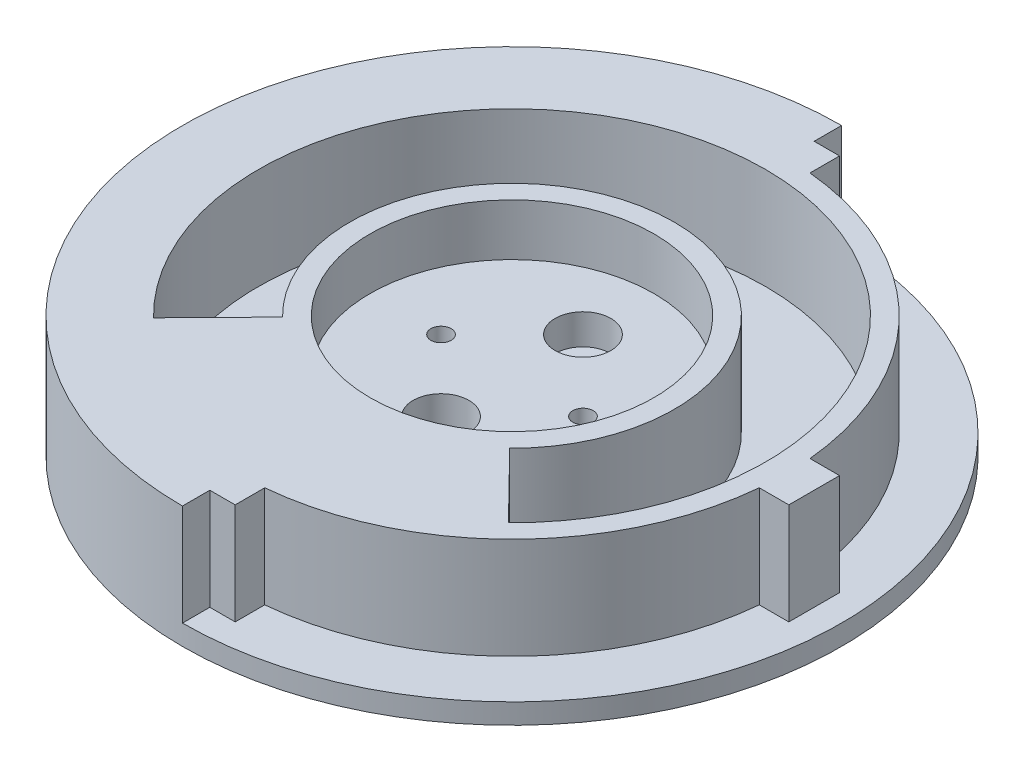
ISO-10303-21;
HEADER;
FILE_DESCRIPTION(('STEP AP214'),'2;1');
FILE_NAME('part.step','',(''),(''),'','','');
FILE_SCHEMA(('AUTOMOTIVE_DESIGN { 1 0 10303 214 1 1 1 1 }'));
ENDSEC;
DATA;
#1=APPLICATION_CONTEXT('core data for automotive mechanical design processes');
#2=APPLICATION_PROTOCOL_DEFINITION('international standard','automotive_design',2000,#1);
#3=PRODUCT_CONTEXT('',#1,'mechanical');
#4=PRODUCT('Part','Part','',(#3));
#5=PRODUCT_RELATED_PRODUCT_CATEGORY('part','',(#4));
#6=PRODUCT_DEFINITION_FORMATION('','',#4);
#7=PRODUCT_DEFINITION_CONTEXT('part definition',#1,'design');
#8=PRODUCT_DEFINITION('design','',#6,#7);
#9=PRODUCT_DEFINITION_SHAPE('','',#8);
#10=(LENGTH_UNIT() NAMED_UNIT(*) SI_UNIT(.MILLI.,.METRE.));
#11=(NAMED_UNIT(*) PLANE_ANGLE_UNIT() SI_UNIT($,.RADIAN.));
#12=(NAMED_UNIT(*) SI_UNIT($,.STERADIAN.) SOLID_ANGLE_UNIT());
#13=UNCERTAINTY_MEASURE_WITH_UNIT(LENGTH_MEASURE(1.E-05),#10,'distance_accuracy_value','');
#14=(GEOMETRIC_REPRESENTATION_CONTEXT(3) GLOBAL_UNCERTAINTY_ASSIGNED_CONTEXT((#13)) GLOBAL_UNIT_ASSIGNED_CONTEXT((#10,
#11,#12)) REPRESENTATION_CONTEXT('',''));
#15=CARTESIAN_POINT('',(0.,0.,0.));
#16=DIRECTION('',(0.,0.,1.));
#17=DIRECTION('',(1.,0.,0.));
#18=AXIS2_PLACEMENT_3D('',#15,#16,#17);
#19=CARTESIAN_POINT('',(0.,10.,7.));
#20=DIRECTION('',(0.,-1.,0.));
#21=DIRECTION('',(0.,0.,-1.));
#22=AXIS2_PLACEMENT_3D('',#19,#20,#21);
#23=CYLINDRICAL_SURFACE('',#22,1.);
#24=CARTESIAN_POINT('',(0.,-2.,7.));
#25=DIRECTION('',(0.,-1.,0.));
#26=DIRECTION('',(0.,0.,-1.));
#27=AXIS2_PLACEMENT_3D('',#24,#25,#26);
#28=CIRCLE('',#27,1.);
#29=CARTESIAN_POINT('',(0.,-2.,6.));
#30=VERTEX_POINT('',#29);
#31=EDGE_CURVE('E277',#30,#30,#28,.T.);
#32=ORIENTED_EDGE('',*,*,#31,.T.);
#33=EDGE_LOOP('',(#32));
#34=FACE_BOUND('',#33,.T.);
#35=CARTESIAN_POINT('',(0.,1.9,7.));
#36=DIRECTION('',(0.,1.,0.));
#37=DIRECTION('',(0.,0.,1.));
#38=AXIS2_PLACEMENT_3D('',#35,#36,#37);
#39=CIRCLE('',#38,1.);
#40=CARTESIAN_POINT('',(0.,1.9,8.));
#41=VERTEX_POINT('',#40);
#42=EDGE_CURVE('E43',#41,#41,#39,.F.);
#43=ORIENTED_EDGE('',*,*,#42,.F.);
#44=EDGE_LOOP('',(#43));
#45=FACE_BOUND('',#44,.T.);
#46=ADVANCED_FACE('F39',(#34,#45),#23,.F.);
#47=CARTESIAN_POINT('',(0.,10.,-7.));
#48=DIRECTION('',(0.,-1.,0.));
#49=DIRECTION('',(0.,0.,-1.));
#50=AXIS2_PLACEMENT_3D('',#47,#48,#49);
#51=CYLINDRICAL_SURFACE('',#50,1.);
#52=CARTESIAN_POINT('',(0.,-2.,-7.));
#53=DIRECTION('',(0.,-1.,0.));
#54=DIRECTION('',(0.,0.,-1.));
#55=AXIS2_PLACEMENT_3D('',#52,#53,#54);
#56=CIRCLE('',#55,1.);
#57=CARTESIAN_POINT('',(0.,-2.,-8.));
#58=VERTEX_POINT('',#57);
#59=EDGE_CURVE('E182',#58,#58,#56,.T.);
#60=ORIENTED_EDGE('',*,*,#59,.T.);
#61=EDGE_LOOP('',(#60));
#62=FACE_BOUND('',#61,.T.);
#63=CARTESIAN_POINT('',(0.,1.9,-7.));
#64=DIRECTION('',(0.,1.,0.));
#65=DIRECTION('',(0.,0.,1.));
#66=AXIS2_PLACEMENT_3D('',#63,#64,#65);
#67=CIRCLE('',#66,1.);
#68=CARTESIAN_POINT('',(0.,1.9,-6.));
#69=VERTEX_POINT('',#68);
#70=EDGE_CURVE('E278',#69,#69,#67,.F.);
#71=ORIENTED_EDGE('',*,*,#70,.F.);
#72=EDGE_LOOP('',(#71));
#73=FACE_BOUND('',#72,.T.);
#74=ADVANCED_FACE('F434',(#62,#73),#51,.F.);
#75=CARTESIAN_POINT('',(0.,0.,0.));
#76=DIRECTION('',(0.,-1.,0.));
#77=DIRECTION('',(0.,0.,-1.));
#78=AXIS2_PLACEMENT_3D('',#75,#76,#77);
#79=PLANE('',#78);
#80=DIRECTION('',(0.,0.,-1.));
#81=VECTOR('',#80,1.);
#82=CARTESIAN_POINT('',(0.,0.,-29.8));
#83=LINE('',#82,#81);
#84=CARTESIAN_POINT('',(0.,0.,-29.8));
#85=VERTEX_POINT('',#84);
#86=CARTESIAN_POINT('',(0.,0.,-32.5));
#87=VERTEX_POINT('',#86);
#88=EDGE_CURVE('E181',#85,#87,#83,.T.);
#89=ORIENTED_EDGE('',*,*,#88,.F.);
#90=DIRECTION('',(-1.,0.,0.));
#91=VECTOR('',#90,1.);
#92=CARTESIAN_POINT('',(-2.5,0.,-29.8));
#93=LINE('',#92,#91);
#94=CARTESIAN_POINT('',(2.5,0.,-29.8));
#95=VERTEX_POINT('',#94);
#96=EDGE_CURVE('E179',#95,#85,#93,.T.);
#97=ORIENTED_EDGE('',*,*,#96,.F.);
#98=DIRECTION('',(0.,0.,-1.));
#99=VECTOR('',#98,1.);
#100=CARTESIAN_POINT('',(2.5,0.,0.));
#101=LINE('',#100,#99);
#102=CARTESIAN_POINT('',(2.5,0.,-26.8840101175401));
#103=VERTEX_POINT('',#102);
#104=EDGE_CURVE('E49',#103,#95,#101,.T.);
#105=ORIENTED_EDGE('',*,*,#104,.F.);
#106=CARTESIAN_POINT('',(0.,0.,0.));
#107=DIRECTION('',(0.,1.,0.));
#108=DIRECTION('',(0.,0.,1.));
#109=AXIS2_PLACEMENT_3D('',#106,#107,#108);
#110=CIRCLE('',#109,27.);
#111=CARTESIAN_POINT('',(26.8840101175398,0.,-2.50000000000318));
#112=VERTEX_POINT('',#111);
#113=EDGE_CURVE('E209',#112,#103,#110,.T.);
#114=ORIENTED_EDGE('',*,*,#113,.F.);
#115=DIRECTION('',(-1.,0.,0.));
#116=VECTOR('',#115,1.);
#117=CARTESIAN_POINT('',(29.8000000000026,0.,-2.50000000000318));
#118=LINE('',#117,#116);
#119=CARTESIAN_POINT('',(29.8000000000026,0.,-2.50000000000318));
#120=VERTEX_POINT('',#119);
#121=EDGE_CURVE('E363',#120,#112,#118,.T.);
#122=ORIENTED_EDGE('',*,*,#121,.F.);
#123=DIRECTION('',(0.,0.,-1.));
#124=VECTOR('',#123,1.);
#125=CARTESIAN_POINT('',(29.8000000000026,0.,-2.50000000000318));
#126=LINE('',#125,#124);
#127=CARTESIAN_POINT('',(29.8000000000026,0.,2.49999999999682));
#128=VERTEX_POINT('',#127);
#129=EDGE_CURVE('E374',#128,#120,#126,.T.);
#130=ORIENTED_EDGE('',*,*,#129,.F.);
#131=DIRECTION('',(1.,0.,0.));
#132=VECTOR('',#131,1.);
#133=CARTESIAN_POINT('',(29.8000000000026,0.,2.49999999999682));
#134=LINE('',#133,#132);
#135=CARTESIAN_POINT('',(26.8840101175404,0.,2.49999999999682));
#136=VERTEX_POINT('',#135);
#137=EDGE_CURVE('E358',#136,#128,#134,.T.);
#138=ORIENTED_EDGE('',*,*,#137,.F.);
#139=CARTESIAN_POINT('',(2.50000000000583,0.,26.8840101175396));
#140=VERTEX_POINT('',#139);
#141=EDGE_CURVE('E233',#140,#136,#110,.T.);
#142=ORIENTED_EDGE('',*,*,#141,.F.);
#143=DIRECTION('',(0.,0.,-1.));
#144=VECTOR('',#143,1.);
#145=CARTESIAN_POINT('',(2.50000000000583,0.,29.7999999999995));
#146=LINE('',#145,#144);
#147=CARTESIAN_POINT('',(2.50000000000583,0.,29.7999999999995));
#148=VERTEX_POINT('',#147);
#149=EDGE_CURVE('E342',#148,#140,#146,.T.);
#150=ORIENTED_EDGE('',*,*,#149,.F.);
#151=DIRECTION('',(1.,0.,0.));
#152=VECTOR('',#151,1.);
#153=CARTESIAN_POINT('',(2.50000000000583,0.,29.7999999999995));
#154=LINE('',#153,#152);
#155=CARTESIAN_POINT('',(0.,0.,29.7999999999995));
#156=VERTEX_POINT('',#155);
#157=EDGE_CURVE('E57',#156,#148,#154,.T.);
#158=ORIENTED_EDGE('',*,*,#157,.F.);
#159=DIRECTION('',(0.,0.,-1.));
#160=VECTOR('',#159,1.);
#161=CARTESIAN_POINT('',(0.,0.,29.7999999999995));
#162=LINE('',#161,#160);
#163=CARTESIAN_POINT('',(0.,0.,32.5));
#164=VERTEX_POINT('',#163);
#165=EDGE_CURVE('E320',#164,#156,#162,.T.);
#166=ORIENTED_EDGE('',*,*,#165,.F.);
#167=CARTESIAN_POINT('',(0.,0.,0.));
#168=DIRECTION('',(0.,-1.,0.));
#169=DIRECTION('',(0.,0.,-1.));
#170=AXIS2_PLACEMENT_3D('',#167,#168,#169);
#171=CIRCLE('',#170,32.5);
#172=EDGE_CURVE('E204',#87,#164,#171,.T.);
#173=ORIENTED_EDGE('',*,*,#172,.F.);
#174=EDGE_LOOP('',(#89,#97,#105,#114,#122,#130,#138,#142,#150,#158,#166,#173));
#175=FACE_BOUND('',#174,.T.);
#176=ADVANCED_FACE('F399',(#175),#79,.F.);
#177=CARTESIAN_POINT('',(-2.5,10.,-29.8));
#178=DIRECTION('',(0.,0.,1.));
#179=DIRECTION('',(1.,0.,0.));
#180=AXIS2_PLACEMENT_3D('',#177,#178,#179);
#181=PLANE('',#180);
#182=DIRECTION('',(0.,-1.,0.));
#183=VECTOR('',#182,1.);
#184=CARTESIAN_POINT('',(0.,82.6722092687432,-29.8));
#185=LINE('',#184,#183);
#186=CARTESIAN_POINT('',(0.,9.99999999999999,-29.8));
#187=VERTEX_POINT('',#186);
#188=EDGE_CURVE('E162',#187,#85,#185,.T.);
#189=ORIENTED_EDGE('',*,*,#188,.F.);
#190=DIRECTION('',(-1.,0.,0.));
#191=VECTOR('',#190,1.);
#192=CARTESIAN_POINT('',(-2.5,10.,-29.8));
#193=LINE('',#192,#191);
#194=CARTESIAN_POINT('',(2.5,10.,-29.8));
#195=VERTEX_POINT('',#194);
#196=EDGE_CURVE('E177',#195,#187,#193,.T.);
#197=ORIENTED_EDGE('',*,*,#196,.F.);
#198=DIRECTION('',(0.,-1.,0.));
#199=VECTOR('',#198,1.);
#200=CARTESIAN_POINT('',(2.5,10.,-29.8));
#201=LINE('',#200,#199);
#202=EDGE_CURVE('E189',#195,#95,#201,.T.);
#203=ORIENTED_EDGE('',*,*,#202,.T.);
#204=ORIENTED_EDGE('',*,*,#96,.T.);
#205=EDGE_LOOP('',(#189,#197,#203,#204));
#206=FACE_BOUND('',#205,.T.);
#207=ADVANCED_FACE('F175',(#206),#181,.F.);
#208=CARTESIAN_POINT('',(2.50000000000583,10.,29.7999999999995));
#209=DIRECTION('',(0.,0.,-1.));
#210=DIRECTION('',(-1.,0.,0.));
#211=AXIS2_PLACEMENT_3D('',#208,#209,#210);
#212=PLANE('',#211);
#213=DIRECTION('',(0.,-1.,0.));
#214=VECTOR('',#213,1.);
#215=CARTESIAN_POINT('',(0.,82.6722092687432,29.7999999999995));
#216=LINE('',#215,#214);
#217=CARTESIAN_POINT('',(0.,9.99999999999999,29.7999999999995));
#218=VERTEX_POINT('',#217);
#219=EDGE_CURVE('E170',#218,#156,#216,.T.);
#220=ORIENTED_EDGE('',*,*,#219,.T.);
#221=ORIENTED_EDGE('',*,*,#157,.T.);
#222=DIRECTION('',(0.,-1.,0.));
#223=VECTOR('',#222,1.);
#224=CARTESIAN_POINT('',(2.50000000000583,10.,29.7999999999995));
#225=LINE('',#224,#223);
#226=CARTESIAN_POINT('',(2.50000000000583,10.,29.7999999999995));
#227=VERTEX_POINT('',#226);
#228=EDGE_CURVE('E346',#227,#148,#225,.T.);
#229=ORIENTED_EDGE('',*,*,#228,.F.);
#230=DIRECTION('',(1.,0.,0.));
#231=VECTOR('',#230,1.);
#232=CARTESIAN_POINT('',(2.50000000000583,10.,29.7999999999995));
#233=LINE('',#232,#231);
#234=EDGE_CURVE('E338',#218,#227,#233,.T.);
#235=ORIENTED_EDGE('',*,*,#234,.F.);
#236=EDGE_LOOP('',(#220,#221,#229,#235));
#237=FACE_BOUND('',#236,.T.);
#238=ADVANCED_FACE('F432',(#237),#212,.F.);
#239=CARTESIAN_POINT('',(0.,10.,0.));
#240=DIRECTION('',(0.,-1.,0.));
#241=DIRECTION('',(0.,0.,-1.));
#242=AXIS2_PLACEMENT_3D('',#239,#240,#241);
#243=CYLINDRICAL_SURFACE('',#242,27.);
#244=DIRECTION('',(0.,-1.,0.));
#245=VECTOR('',#244,1.);
#246=CARTESIAN_POINT('',(2.50000000000583,10.,26.8840101175396));
#247=LINE('',#246,#245);
#248=CARTESIAN_POINT('',(2.50000000000583,10.,26.8840101175396));
#249=VERTEX_POINT('',#248);
#250=EDGE_CURVE('E355',#140,#249,#247,.F.);
#251=ORIENTED_EDGE('',*,*,#250,.F.);
#252=ORIENTED_EDGE('',*,*,#141,.T.);
#253=DIRECTION('',(0.,-1.,0.));
#254=VECTOR('',#253,1.);
#255=CARTESIAN_POINT('',(26.8840101175404,10.,2.49999999999682));
#256=LINE('',#255,#254);
#257=CARTESIAN_POINT('',(26.8840101175404,10.,2.49999999999682));
#258=VERTEX_POINT('',#257);
#259=EDGE_CURVE('E199',#258,#136,#256,.T.);
#260=ORIENTED_EDGE('',*,*,#259,.F.);
#261=CARTESIAN_POINT('',(0.,10.,0.));
#262=DIRECTION('',(0.,1.,0.));
#263=DIRECTION('',(0.,0.,1.));
#264=AXIS2_PLACEMENT_3D('',#261,#262,#263);
#265=CIRCLE('',#264,27.);
#266=EDGE_CURVE('E65',#249,#258,#265,.T.);
#267=ORIENTED_EDGE('',*,*,#266,.F.);
#268=EDGE_LOOP('',(#251,#252,#260,#267));
#269=FACE_BOUND('',#268,.T.);
#270=ADVANCED_FACE('F41',(#269),#243,.T.);
#271=DIRECTION('',(0.,-1.,0.));
#272=VECTOR('',#271,1.);
#273=CARTESIAN_POINT('',(26.8840101175398,10.,-2.50000000000318));
#274=LINE('',#273,#272);
#275=CARTESIAN_POINT('',(26.8840101175398,10.,-2.50000000000318));
#276=VERTEX_POINT('',#275);
#277=EDGE_CURVE('E388',#112,#276,#274,.F.);
#278=ORIENTED_EDGE('',*,*,#277,.F.);
#279=ORIENTED_EDGE('',*,*,#113,.T.);
#280=DIRECTION('',(0.,-1.,0.));
#281=VECTOR('',#280,1.);
#282=CARTESIAN_POINT('',(2.5,10.,-26.8840101175401));
#283=LINE('',#282,#281);
#284=CARTESIAN_POINT('',(2.5,10.,-26.8840101175401));
#285=VERTEX_POINT('',#284);
#286=EDGE_CURVE('E193',#285,#103,#283,.T.);
#287=ORIENTED_EDGE('',*,*,#286,.F.);
#288=EDGE_CURVE('E260',#276,#285,#265,.T.);
#289=ORIENTED_EDGE('',*,*,#288,.F.);
#290=EDGE_LOOP('',(#278,#279,#287,#289));
#291=FACE_BOUND('',#290,.T.);
#292=ADVANCED_FACE('F423',(#291),#243,.T.);
#293=CARTESIAN_POINT('',(0.,10.,0.));
#294=DIRECTION('',(0.,1.,0.));
#295=DIRECTION('',(0.,0.,1.));
#296=AXIS2_PLACEMENT_3D('',#293,#294,#295);
#297=PLANE('',#296);
#298=ORIENTED_EDGE('',*,*,#196,.T.);
#299=DIRECTION('',(0.,0.,-1.));
#300=VECTOR('',#299,1.);
#301=CARTESIAN_POINT('',(0.,9.99999999999999,-29.8));
#302=LINE('',#301,#300);
#303=CARTESIAN_POINT('',(0.,9.99999999999999,-32.5));
#304=VERTEX_POINT('',#303);
#305=EDGE_CURVE('E158',#187,#304,#302,.T.);
#306=ORIENTED_EDGE('',*,*,#305,.T.);
#307=CARTESIAN_POINT('',(0.,9.99999999999999,0.));
#308=DIRECTION('',(0.,1.,0.));
#309=DIRECTION('',(0.,0.,1.));
#310=AXIS2_PLACEMENT_3D('',#307,#308,#309);
#311=CIRCLE('',#310,32.5);
#312=CARTESIAN_POINT('',(0.,9.99999999999999,32.5));
#313=VERTEX_POINT('',#312);
#314=EDGE_CURVE('E169',#304,#313,#311,.T.);
#315=ORIENTED_EDGE('',*,*,#314,.T.);
#316=DIRECTION('',(0.,0.,-1.));
#317=VECTOR('',#316,1.);
#318=CARTESIAN_POINT('',(0.,9.99999999999999,29.7999999999995));
#319=LINE('',#318,#317);
#320=EDGE_CURVE('E326',#313,#218,#319,.T.);
#321=ORIENTED_EDGE('',*,*,#320,.T.);
#322=ORIENTED_EDGE('',*,*,#234,.T.);
#323=DIRECTION('',(0.,0.,-1.));
#324=VECTOR('',#323,1.);
#325=CARTESIAN_POINT('',(2.50000000000583,10.,29.7999999999995));
#326=LINE('',#325,#324);
#327=EDGE_CURVE('E341',#227,#249,#326,.T.);
#328=ORIENTED_EDGE('',*,*,#327,.T.);
#329=ORIENTED_EDGE('',*,*,#266,.T.);
#330=DIRECTION('',(1.,0.,0.));
#331=VECTOR('',#330,1.);
#332=CARTESIAN_POINT('',(29.8000000000026,10.,2.49999999999682));
#333=LINE('',#332,#331);
#334=CARTESIAN_POINT('',(29.8000000000026,10.,2.49999999999682));
#335=VERTEX_POINT('',#334);
#336=EDGE_CURVE('E359',#258,#335,#333,.T.);
#337=ORIENTED_EDGE('',*,*,#336,.T.);
#338=DIRECTION('',(0.,0.,-1.));
#339=VECTOR('',#338,1.);
#340=CARTESIAN_POINT('',(29.8000000000026,10.,-2.50000000000318));
#341=LINE('',#340,#339);
#342=CARTESIAN_POINT('',(29.8000000000026,10.,-2.50000000000318));
#343=VERTEX_POINT('',#342);
#344=EDGE_CURVE('E362',#335,#343,#341,.T.);
#345=ORIENTED_EDGE('',*,*,#344,.T.);
#346=DIRECTION('',(-1.,0.,0.));
#347=VECTOR('',#346,1.);
#348=CARTESIAN_POINT('',(29.8000000000026,10.,-2.50000000000318));
#349=LINE('',#348,#347);
#350=EDGE_CURVE('E366',#343,#276,#349,.T.);
#351=ORIENTED_EDGE('',*,*,#350,.T.);
#352=ORIENTED_EDGE('',*,*,#288,.T.);
#353=DIRECTION('',(0.,0.,-1.));
#354=VECTOR('',#353,1.);
#355=CARTESIAN_POINT('',(2.5,10.,-29.8));
#356=LINE('',#355,#354);
#357=EDGE_CURVE('E187',#285,#195,#356,.T.);
#358=ORIENTED_EDGE('',*,*,#357,.T.);
#359=EDGE_LOOP('',(#298,#306,#315,#321,#322,#328,#329,#337,#345,#351,#352,#358));
#360=FACE_BOUND('',#359,.T.);
#361=CARTESIAN_POINT('',(0.,10.,0.));
#362=DIRECTION('',(0.,1.,0.));
#363=DIRECTION('',(0.,0.,1.));
#364=AXIS2_PLACEMENT_3D('',#361,#362,#363);
#365=CIRCLE('',#364,14.);
#366=CARTESIAN_POINT('',(0.,10.,14.));
#367=VERTEX_POINT('',#366);
#368=EDGE_CURVE('E256',#367,#367,#365,.T.);
#369=ORIENTED_EDGE('',*,*,#368,.F.);
#370=EDGE_LOOP('',(#369));
#371=FACE_BOUND('',#370,.T.);
#372=DIRECTION('',(0.7,0.,-0.714142842854285));
#373=VECTOR('',#372,1.);
#374=CARTESIAN_POINT('',(-17.5,10.,17.8535710713571));
#375=LINE('',#374,#373);
#376=CARTESIAN_POINT('',(-17.5,10.,17.8535710713571));
#377=VERTEX_POINT('',#376);
#378=CARTESIAN_POINT('',(-11.2,10.,11.4262854856686));
#379=VERTEX_POINT('',#378);
#380=EDGE_CURVE('E216',#377,#379,#375,.T.);
#381=ORIENTED_EDGE('',*,*,#380,.F.);
#382=CARTESIAN_POINT('',(0.,10.,0.));
#383=DIRECTION('',(0.,1.,0.));
#384=DIRECTION('',(0.,0.,1.));
#385=AXIS2_PLACEMENT_3D('',#382,#383,#384);
#386=CIRCLE('',#385,25.);
#387=CARTESIAN_POINT('',(17.5,10.,17.8535710713571));
#388=VERTEX_POINT('',#387);
#389=EDGE_CURVE('E213',#388,#377,#386,.T.);
#390=ORIENTED_EDGE('',*,*,#389,.F.);
#391=DIRECTION('',(0.7,0.,0.714142842854285));
#392=VECTOR('',#391,1.);
#393=CARTESIAN_POINT('',(17.5,10.,17.8535710713571));
#394=LINE('',#393,#392);
#395=CARTESIAN_POINT('',(11.2,10.,11.4262854856686));
#396=VERTEX_POINT('',#395);
#397=EDGE_CURVE('E224',#396,#388,#394,.T.);
#398=ORIENTED_EDGE('',*,*,#397,.F.);
#399=CARTESIAN_POINT('',(0.,10.,0.));
#400=DIRECTION('',(0.,-1.,0.));
#401=DIRECTION('',(0.,0.,1.));
#402=AXIS2_PLACEMENT_3D('',#399,#400,#401);
#403=CIRCLE('',#402,16.);
#404=EDGE_CURVE('E220',#379,#396,#403,.T.);
#405=ORIENTED_EDGE('',*,*,#404,.F.);
#406=EDGE_LOOP('',(#381,#390,#398,#405));
#407=FACE_BOUND('',#406,.T.);
#408=ADVANCED_FACE('F184',(#360,#371,#407),#297,.T.);
#409=CARTESIAN_POINT('',(0.,10.,0.));
#410=DIRECTION('',(0.,-1.,0.));
#411=DIRECTION('',(0.,0.,-1.));
#412=AXIS2_PLACEMENT_3D('',#409,#410,#411);
#413=CYLINDRICAL_SURFACE('',#412,14.);
#414=CARTESIAN_POINT('',(0.,4.9,0.));
#415=DIRECTION('',(0.,1.,0.));
#416=DIRECTION('',(0.,0.,1.));
#417=AXIS2_PLACEMENT_3D('',#414,#415,#416);
#418=CIRCLE('',#417,14.);
#419=CARTESIAN_POINT('',(0.,4.9,14.));
#420=VERTEX_POINT('',#419);
#421=EDGE_CURVE('E11',#420,#420,#418,.T.);
#422=ORIENTED_EDGE('',*,*,#421,.F.);
#423=EDGE_LOOP('',(#422));
#424=FACE_BOUND('',#423,.T.);
#425=ORIENTED_EDGE('',*,*,#368,.T.);
#426=EDGE_LOOP('',(#425));
#427=FACE_BOUND('',#426,.T.);
#428=ADVANCED_FACE('F431',(#424,#427),#413,.F.);
#429=CARTESIAN_POINT('',(0.,10.,0.));
#430=DIRECTION('',(0.,-1.,0.));
#431=DIRECTION('',(0.,0.,-1.));
#432=AXIS2_PLACEMENT_3D('',#429,#430,#431);
#433=CYLINDRICAL_SURFACE('',#432,25.);
#434=CARTESIAN_POINT('',(0.,0.,0.));
#435=DIRECTION('',(0.,1.,0.));
#436=DIRECTION('',(0.,0.,1.));
#437=AXIS2_PLACEMENT_3D('',#434,#435,#436);
#438=CIRCLE('',#437,25.);
#439=CARTESIAN_POINT('',(17.5,0.,17.8535710713571));
#440=VERTEX_POINT('',#439);
#441=CARTESIAN_POINT('',(-17.5,0.,17.8535710713571));
#442=VERTEX_POINT('',#441);
#443=EDGE_CURVE('E228',#440,#442,#438,.T.);
#444=ORIENTED_EDGE('',*,*,#443,.F.);
#445=DIRECTION('',(0.,-1.,0.));
#446=VECTOR('',#445,1.);
#447=CARTESIAN_POINT('',(17.5,10.,17.8535710713571));
#448=LINE('',#447,#446);
#449=EDGE_CURVE('E227',#388,#440,#448,.T.);
#450=ORIENTED_EDGE('',*,*,#449,.F.);
#451=ORIENTED_EDGE('',*,*,#389,.T.);
#452=DIRECTION('',(0.,-1.,0.));
#453=VECTOR('',#452,1.);
#454=CARTESIAN_POINT('',(-17.5,10.,17.8535710713571));
#455=LINE('',#454,#453);
#456=EDGE_CURVE('E252',#377,#442,#455,.T.);
#457=ORIENTED_EDGE('',*,*,#456,.T.);
#458=EDGE_LOOP('',(#444,#450,#451,#457));
#459=FACE_BOUND('',#458,.T.);
#460=ADVANCED_FACE('F494',(#459),#433,.F.);
#461=CARTESIAN_POINT('',(-17.5,10.,17.8535710713571));
#462=DIRECTION('',(-0.714142842854285,0.,-0.7));
#463=DIRECTION('',(-0.7,0.,0.714142842854285));
#464=AXIS2_PLACEMENT_3D('',#461,#462,#463);
#465=PLANE('',#464);
#466=DIRECTION('',(0.7,0.,-0.714142842854285));
#467=VECTOR('',#466,1.);
#468=CARTESIAN_POINT('',(-17.5,0.,17.8535710713571));
#469=LINE('',#468,#467);
#470=CARTESIAN_POINT('',(-11.2,0.,11.4262854856686));
#471=VERTEX_POINT('',#470);
#472=EDGE_CURVE('E232',#442,#471,#469,.T.);
#473=ORIENTED_EDGE('',*,*,#472,.F.);
#474=ORIENTED_EDGE('',*,*,#456,.F.);
#475=ORIENTED_EDGE('',*,*,#380,.T.);
#476=DIRECTION('',(0.,-1.,0.));
#477=VECTOR('',#476,1.);
#478=CARTESIAN_POINT('',(-11.2,10.,11.4262854856686));
#479=LINE('',#478,#477);
#480=EDGE_CURVE('E249',#379,#471,#479,.T.);
#481=ORIENTED_EDGE('',*,*,#480,.T.);
#482=EDGE_LOOP('',(#473,#474,#475,#481));
#483=FACE_BOUND('',#482,.T.);
#484=ADVANCED_FACE('F490',(#483),#465,.T.);
#485=CARTESIAN_POINT('',(0.,10.,0.));
#486=DIRECTION('',(0.,-1.,0.));
#487=DIRECTION('',(0.,0.,-1.));
#488=AXIS2_PLACEMENT_3D('',#485,#486,#487);
#489=CYLINDRICAL_SURFACE('',#488,16.);
#490=CARTESIAN_POINT('',(0.,0.,0.));
#491=DIRECTION('',(0.,-1.,0.));
#492=DIRECTION('',(0.,0.,1.));
#493=AXIS2_PLACEMENT_3D('',#490,#491,#492);
#494=CIRCLE('',#493,16.);
#495=CARTESIAN_POINT('',(11.2,0.,11.4262854856686));
#496=VERTEX_POINT('',#495);
#497=EDGE_CURVE('E237',#471,#496,#494,.T.);
#498=ORIENTED_EDGE('',*,*,#497,.F.);
#499=ORIENTED_EDGE('',*,*,#480,.F.);
#500=ORIENTED_EDGE('',*,*,#404,.T.);
#501=DIRECTION('',(0.,-1.,0.));
#502=VECTOR('',#501,1.);
#503=CARTESIAN_POINT('',(11.2,10.,11.4262854856686));
#504=LINE('',#503,#502);
#505=EDGE_CURVE('E246',#396,#496,#504,.T.);
#506=ORIENTED_EDGE('',*,*,#505,.T.);
#507=EDGE_LOOP('',(#498,#499,#500,#506));
#508=FACE_BOUND('',#507,.T.);
#509=ADVANCED_FACE('F486',(#508),#489,.T.);
#510=CARTESIAN_POINT('',(17.5,10.,17.8535710713571));
#511=DIRECTION('',(0.714142842854285,0.,-0.7));
#512=DIRECTION('',(-0.7,0.,-0.714142842854285));
#513=AXIS2_PLACEMENT_3D('',#510,#511,#512);
#514=PLANE('',#513);
#515=DIRECTION('',(0.7,0.,0.714142842854285));
#516=VECTOR('',#515,1.);
#517=CARTESIAN_POINT('',(17.5,0.,17.8535710713571));
#518=LINE('',#517,#516);
#519=EDGE_CURVE('E217',#496,#440,#518,.T.);
#520=ORIENTED_EDGE('',*,*,#519,.F.);
#521=ORIENTED_EDGE('',*,*,#505,.F.);
#522=ORIENTED_EDGE('',*,*,#397,.T.);
#523=ORIENTED_EDGE('',*,*,#449,.T.);
#524=EDGE_LOOP('',(#520,#521,#522,#523));
#525=FACE_BOUND('',#524,.T.);
#526=ADVANCED_FACE('F483',(#525),#514,.T.);
#527=ORIENTED_EDGE('',*,*,#519,.T.);
#528=ORIENTED_EDGE('',*,*,#443,.T.);
#529=ORIENTED_EDGE('',*,*,#472,.T.);
#530=ORIENTED_EDGE('',*,*,#497,.T.);
#531=EDGE_LOOP('',(#527,#528,#529,#530));
#532=FACE_BOUND('',#531,.T.);
#533=ADVANCED_FACE('F476',(#532),#79,.F.);
#534=CARTESIAN_POINT('',(0.,-2.,0.));
#535=DIRECTION('',(0.,-1.,0.));
#536=DIRECTION('',(0.,0.,-1.));
#537=AXIS2_PLACEMENT_3D('',#534,#535,#536);
#538=PLANE('',#537);
#539=CARTESIAN_POINT('',(0.,-2.,0.));
#540=DIRECTION('',(0.,-1.,0.));
#541=DIRECTION('',(0.,0.,-1.));
#542=AXIS2_PLACEMENT_3D('',#539,#540,#541);
#543=CIRCLE('',#542,4.);
#544=CARTESIAN_POINT('',(0.,-2.,-4.));
#545=VERTEX_POINT('',#544);
#546=EDGE_CURVE('E297',#545,#545,#543,.T.);
#547=ORIENTED_EDGE('',*,*,#546,.F.);
#548=EDGE_LOOP('',(#547));
#549=FACE_BOUND('',#548,.T.);
#550=ORIENTED_EDGE('',*,*,#59,.F.);
#551=EDGE_LOOP('',(#550));
#552=FACE_BOUND('',#551,.T.);
#553=CARTESIAN_POINT('',(-7.,-2.,0.));
#554=DIRECTION('',(0.,-1.,0.));
#555=DIRECTION('',(0.,0.,-1.));
#556=AXIS2_PLACEMENT_3D('',#553,#554,#555);
#557=CIRCLE('',#556,1.);
#558=CARTESIAN_POINT('',(-7.,-2.,-0.999999999999975));
#559=VERTEX_POINT('',#558);
#560=EDGE_CURVE('E276',#559,#559,#557,.T.);
#561=ORIENTED_EDGE('',*,*,#560,.F.);
#562=EDGE_LOOP('',(#561));
#563=FACE_BOUND('',#562,.T.);
#564=ORIENTED_EDGE('',*,*,#31,.F.);
#565=EDGE_LOOP('',(#564));
#566=FACE_BOUND('',#565,.T.);
#567=CARTESIAN_POINT('',(7.,-2.,0.));
#568=DIRECTION('',(0.,-1.,0.));
#569=DIRECTION('',(0.,0.,-1.));
#570=AXIS2_PLACEMENT_3D('',#567,#568,#569);
#571=CIRCLE('',#570,1.);
#572=CARTESIAN_POINT('',(7.,-2.,-1.00000000000007));
#573=VERTEX_POINT('',#572);
#574=EDGE_CURVE('E272',#573,#573,#571,.T.);
#575=ORIENTED_EDGE('',*,*,#574,.F.);
#576=EDGE_LOOP('',(#575));
#577=FACE_BOUND('',#576,.T.);
#578=CARTESIAN_POINT('',(0.,-2.,0.));
#579=DIRECTION('',(0.,-1.,0.));
#580=DIRECTION('',(0.,0.,-1.));
#581=AXIS2_PLACEMENT_3D('',#578,#579,#580);
#582=CIRCLE('',#581,32.5);
#583=CARTESIAN_POINT('',(0.,-2.,-32.5));
#584=VERTEX_POINT('',#583);
#585=EDGE_CURVE('E205',#584,#584,#582,.T.);
#586=ORIENTED_EDGE('',*,*,#585,.T.);
#587=EDGE_LOOP('',(#586));
#588=FACE_BOUND('',#587,.T.);
#589=ADVANCED_FACE('F473',(#549,#552,#563,#566,#577,#588),#538,.T.);
#590=CARTESIAN_POINT('',(0.,-2.,0.));
#591=DIRECTION('',(0.,1.,0.));
#592=DIRECTION('',(0.,0.,1.));
#593=AXIS2_PLACEMENT_3D('',#590,#591,#592);
#594=CYLINDRICAL_SURFACE('',#593,32.5);
#595=ORIENTED_EDGE('',*,*,#585,.F.);
#596=EDGE_LOOP('',(#595));
#597=FACE_BOUND('',#596,.T.);
#598=ORIENTED_EDGE('',*,*,#172,.T.);
#599=DIRECTION('',(0.,-1.,0.));
#600=VECTOR('',#599,1.);
#601=CARTESIAN_POINT('',(0.,82.6722092687432,32.5));
#602=LINE('',#601,#600);
#603=EDGE_CURVE('E323',#313,#164,#602,.T.);
#604=ORIENTED_EDGE('',*,*,#603,.F.);
#605=ORIENTED_EDGE('',*,*,#314,.F.);
#606=DIRECTION('',(0.,-1.,0.));
#607=VECTOR('',#606,1.);
#608=CARTESIAN_POINT('',(0.,82.6722092687432,-32.5));
#609=LINE('',#608,#607);
#610=EDGE_CURVE('E164',#304,#87,#609,.T.);
#611=ORIENTED_EDGE('',*,*,#610,.T.);
#612=EDGE_LOOP('',(#598,#604,#605,#611));
#613=FACE_BOUND('',#612,.T.);
#614=ADVANCED_FACE('F418',(#597,#613),#594,.T.);
#615=CARTESIAN_POINT('',(2.5,10.,-29.8));
#616=DIRECTION('',(-1.,0.,0.));
#617=DIRECTION('',(0.,0.,1.));
#618=AXIS2_PLACEMENT_3D('',#615,#616,#617);
#619=PLANE('',#618);
#620=ORIENTED_EDGE('',*,*,#357,.F.);
#621=ORIENTED_EDGE('',*,*,#286,.T.);
#622=ORIENTED_EDGE('',*,*,#104,.T.);
#623=ORIENTED_EDGE('',*,*,#202,.F.);
#624=EDGE_LOOP('',(#620,#621,#622,#623));
#625=FACE_BOUND('',#624,.T.);
#626=ADVANCED_FACE('F421',(#625),#619,.F.);
#627=CARTESIAN_POINT('',(29.8000000000026,10.,2.49999999999682));
#628=DIRECTION('',(0.,0.,-1.));
#629=DIRECTION('',(-1.,0.,0.));
#630=AXIS2_PLACEMENT_3D('',#627,#628,#629);
#631=PLANE('',#630);
#632=ORIENTED_EDGE('',*,*,#336,.F.);
#633=ORIENTED_EDGE('',*,*,#259,.T.);
#634=ORIENTED_EDGE('',*,*,#137,.T.);
#635=DIRECTION('',(0.,-1.,0.));
#636=VECTOR('',#635,1.);
#637=CARTESIAN_POINT('',(29.8000000000026,10.,2.49999999999682));
#638=LINE('',#637,#636);
#639=EDGE_CURVE('E384',#335,#128,#638,.T.);
#640=ORIENTED_EDGE('',*,*,#639,.F.);
#641=EDGE_LOOP('',(#632,#633,#634,#640));
#642=FACE_BOUND('',#641,.T.);
#643=ADVANCED_FACE('F395',(#642),#631,.F.);
#644=CARTESIAN_POINT('',(29.8000000000026,10.,-2.50000000000318));
#645=DIRECTION('',(0.,0.,1.));
#646=DIRECTION('',(1.,0.,0.));
#647=AXIS2_PLACEMENT_3D('',#644,#645,#646);
#648=PLANE('',#647);
#649=ORIENTED_EDGE('',*,*,#121,.T.);
#650=ORIENTED_EDGE('',*,*,#277,.T.);
#651=ORIENTED_EDGE('',*,*,#350,.F.);
#652=DIRECTION('',(0.,-1.,0.));
#653=VECTOR('',#652,1.);
#654=CARTESIAN_POINT('',(29.8000000000026,10.,-2.50000000000318));
#655=LINE('',#654,#653);
#656=EDGE_CURVE('E370',#343,#120,#655,.T.);
#657=ORIENTED_EDGE('',*,*,#656,.T.);
#658=EDGE_LOOP('',(#649,#650,#651,#657));
#659=FACE_BOUND('',#658,.T.);
#660=ADVANCED_FACE('F406',(#659),#648,.F.);
#661=CARTESIAN_POINT('',(29.8000000000026,10.,-2.50000000000318));
#662=DIRECTION('',(-1.,0.,0.));
#663=DIRECTION('',(0.,0.,1.));
#664=AXIS2_PLACEMENT_3D('',#661,#662,#663);
#665=PLANE('',#664);
#666=ORIENTED_EDGE('',*,*,#129,.T.);
#667=ORIENTED_EDGE('',*,*,#656,.F.);
#668=ORIENTED_EDGE('',*,*,#344,.F.);
#669=ORIENTED_EDGE('',*,*,#639,.T.);
#670=EDGE_LOOP('',(#666,#667,#668,#669));
#671=FACE_BOUND('',#670,.T.);
#672=ADVANCED_FACE('F402',(#671),#665,.F.);
#673=CARTESIAN_POINT('',(2.50000000000583,10.,29.7999999999995));
#674=DIRECTION('',(-1.,0.,0.));
#675=DIRECTION('',(0.,0.,1.));
#676=AXIS2_PLACEMENT_3D('',#673,#674,#675);
#677=PLANE('',#676);
#678=ORIENTED_EDGE('',*,*,#149,.T.);
#679=ORIENTED_EDGE('',*,*,#250,.T.);
#680=ORIENTED_EDGE('',*,*,#327,.F.);
#681=ORIENTED_EDGE('',*,*,#228,.T.);
#682=EDGE_LOOP('',(#678,#679,#680,#681));
#683=FACE_BOUND('',#682,.T.);
#684=ADVANCED_FACE('F412',(#683),#677,.F.);
#685=CARTESIAN_POINT('',(0.,82.6722092687432,-29.8));
#686=DIRECTION('',(-1.,0.,0.));
#687=DIRECTION('',(0.,0.,1.));
#688=AXIS2_PLACEMENT_3D('',#685,#686,#687);
#689=PLANE('',#688);
#690=ORIENTED_EDGE('',*,*,#305,.F.);
#691=ORIENTED_EDGE('',*,*,#188,.T.);
#692=ORIENTED_EDGE('',*,*,#88,.T.);
#693=ORIENTED_EDGE('',*,*,#610,.F.);
#694=EDGE_LOOP('',(#690,#691,#692,#693));
#695=FACE_BOUND('',#694,.T.);
#696=ADVANCED_FACE('F160',(#695),#689,.F.);
#697=CARTESIAN_POINT('',(0.,82.6722092687432,29.7999999999995));
#698=DIRECTION('',(-1.,0.,0.));
#699=DIRECTION('',(0.,0.,1.));
#700=AXIS2_PLACEMENT_3D('',#697,#698,#699);
#701=PLANE('',#700);
#702=ORIENTED_EDGE('',*,*,#320,.F.);
#703=ORIENTED_EDGE('',*,*,#603,.T.);
#704=ORIENTED_EDGE('',*,*,#165,.T.);
#705=ORIENTED_EDGE('',*,*,#219,.F.);
#706=EDGE_LOOP('',(#702,#703,#704,#705));
#707=FACE_BOUND('',#706,.T.);
#708=ADVANCED_FACE('F453',(#707),#701,.F.);
#709=CARTESIAN_POINT('',(0.,4.9,0.));
#710=DIRECTION('',(0.,1.,0.));
#711=DIRECTION('',(0.,0.,1.));
#712=AXIS2_PLACEMENT_3D('',#709,#710,#711);
#713=PLANE('',#712);
#714=CARTESIAN_POINT('',(0.,4.9,-7.));
#715=DIRECTION('',(0.,1.,0.));
#716=DIRECTION('',(0.,0.,1.));
#717=AXIS2_PLACEMENT_3D('',#714,#715,#716);
#718=CIRCLE('',#717,2.75);
#719=CARTESIAN_POINT('',(0.,4.9,-4.25));
#720=VERTEX_POINT('',#719);
#721=EDGE_CURVE('E288',#720,#720,#718,.T.);
#722=ORIENTED_EDGE('',*,*,#721,.F.);
#723=EDGE_LOOP('',(#722));
#724=FACE_BOUND('',#723,.T.);
#725=CARTESIAN_POINT('',(0.,4.9,7.));
#726=DIRECTION('',(0.,1.,0.));
#727=DIRECTION('',(0.,0.,1.));
#728=AXIS2_PLACEMENT_3D('',#725,#726,#727);
#729=CIRCLE('',#728,2.75);
#730=CARTESIAN_POINT('',(0.,4.9,9.75));
#731=VERTEX_POINT('',#730);
#732=EDGE_CURVE('E303',#731,#731,#729,.T.);
#733=ORIENTED_EDGE('',*,*,#732,.F.);
#734=EDGE_LOOP('',(#733));
#735=FACE_BOUND('',#734,.T.);
#736=CARTESIAN_POINT('',(-7.,4.9,0.));
#737=DIRECTION('',(0.,1.,0.));
#738=DIRECTION('',(0.,0.,1.));
#739=AXIS2_PLACEMENT_3D('',#736,#737,#738);
#740=CIRCLE('',#739,1.);
#741=CARTESIAN_POINT('',(-7.,4.9,1.00000000000002));
#742=VERTEX_POINT('',#741);
#743=EDGE_CURVE('E273',#742,#742,#740,.T.);
#744=ORIENTED_EDGE('',*,*,#743,.F.);
#745=EDGE_LOOP('',(#744));
#746=FACE_BOUND('',#745,.T.);
#747=CARTESIAN_POINT('',(7.,4.9,0.));
#748=DIRECTION('',(0.,1.,0.));
#749=DIRECTION('',(0.,0.,1.));
#750=AXIS2_PLACEMENT_3D('',#747,#748,#749);
#751=CIRCLE('',#750,1.);
#752=CARTESIAN_POINT('',(7.,4.9,0.999999999999926));
#753=VERTEX_POINT('',#752);
#754=EDGE_CURVE('E268',#753,#753,#751,.T.);
#755=ORIENTED_EDGE('',*,*,#754,.F.);
#756=EDGE_LOOP('',(#755));
#757=FACE_BOUND('',#756,.T.);
#758=ORIENTED_EDGE('',*,*,#421,.T.);
#759=EDGE_LOOP('',(#758));
#760=FACE_BOUND('',#759,.T.);
#761=ADVANCED_FACE('F449',(#724,#735,#746,#757,#760),#713,.T.);
#762=CARTESIAN_POINT('',(7.,10.,0.));
#763=DIRECTION('',(0.,-1.,0.));
#764=DIRECTION('',(0.,0.,-1.));
#765=AXIS2_PLACEMENT_3D('',#762,#763,#764);
#766=CYLINDRICAL_SURFACE('',#765,1.);
#767=ORIENTED_EDGE('',*,*,#574,.T.);
#768=EDGE_LOOP('',(#767));
#769=FACE_BOUND('',#768,.T.);
#770=ORIENTED_EDGE('',*,*,#754,.T.);
#771=EDGE_LOOP('',(#770));
#772=FACE_BOUND('',#771,.T.);
#773=ADVANCED_FACE('F446',(#769,#772),#766,.F.);
#774=CARTESIAN_POINT('',(-7.,10.,0.));
#775=DIRECTION('',(0.,-1.,0.));
#776=DIRECTION('',(0.,0.,-1.));
#777=AXIS2_PLACEMENT_3D('',#774,#775,#776);
#778=CYLINDRICAL_SURFACE('',#777,1.);
#779=ORIENTED_EDGE('',*,*,#560,.T.);
#780=EDGE_LOOP('',(#779));
#781=FACE_BOUND('',#780,.T.);
#782=ORIENTED_EDGE('',*,*,#743,.T.);
#783=EDGE_LOOP('',(#782));
#784=FACE_BOUND('',#783,.T.);
#785=ADVANCED_FACE('F445',(#781,#784),#778,.F.);
#786=CARTESIAN_POINT('',(0.,1.9,-7.));
#787=DIRECTION('',(0.,1.,0.));
#788=DIRECTION('',(0.,0.,1.));
#789=AXIS2_PLACEMENT_3D('',#786,#787,#788);
#790=PLANE('',#789);
#791=CARTESIAN_POINT('',(0.,1.9,-7.));
#792=DIRECTION('',(0.,1.,0.));
#793=DIRECTION('',(0.,0.,1.));
#794=AXIS2_PLACEMENT_3D('',#791,#792,#793);
#795=CIRCLE('',#794,2.75);
#796=CARTESIAN_POINT('',(0.,1.9,-4.25));
#797=VERTEX_POINT('',#796);
#798=EDGE_CURVE('E281',#797,#797,#795,.T.);
#799=ORIENTED_EDGE('',*,*,#798,.T.);
#800=EDGE_LOOP('',(#799));
#801=FACE_BOUND('',#800,.T.);
#802=ORIENTED_EDGE('',*,*,#70,.T.);
#803=EDGE_LOOP('',(#802));
#804=FACE_BOUND('',#803,.T.);
#805=ADVANCED_FACE('F580',(#801,#804),#790,.T.);
#806=CARTESIAN_POINT('',(0.,1.9,-7.));
#807=DIRECTION('',(0.,1.,0.));
#808=DIRECTION('',(0.,0.,1.));
#809=AXIS2_PLACEMENT_3D('',#806,#807,#808);
#810=CYLINDRICAL_SURFACE('',#809,2.75);
#811=ORIENTED_EDGE('',*,*,#798,.F.);
#812=EDGE_LOOP('',(#811));
#813=FACE_BOUND('',#812,.T.);
#814=ORIENTED_EDGE('',*,*,#721,.T.);
#815=EDGE_LOOP('',(#814));
#816=FACE_BOUND('',#815,.T.);
#817=ADVANCED_FACE('F586',(#813,#816),#810,.F.);
#818=CARTESIAN_POINT('',(0.,1.9,7.));
#819=DIRECTION('',(0.,1.,0.));
#820=DIRECTION('',(0.,0.,1.));
#821=AXIS2_PLACEMENT_3D('',#818,#819,#820);
#822=PLANE('',#821);
#823=CARTESIAN_POINT('',(0.,1.9,7.));
#824=DIRECTION('',(0.,1.,0.));
#825=DIRECTION('',(0.,0.,1.));
#826=AXIS2_PLACEMENT_3D('',#823,#824,#825);
#827=CIRCLE('',#826,2.75);
#828=CARTESIAN_POINT('',(0.,1.9,9.75));
#829=VERTEX_POINT('',#828);
#830=EDGE_CURVE('E294',#829,#829,#827,.T.);
#831=ORIENTED_EDGE('',*,*,#830,.T.);
#832=EDGE_LOOP('',(#831));
#833=FACE_BOUND('',#832,.T.);
#834=ORIENTED_EDGE('',*,*,#42,.T.);
#835=EDGE_LOOP('',(#834));
#836=FACE_BOUND('',#835,.T.);
#837=ADVANCED_FACE('F593',(#833,#836),#822,.T.);
#838=CARTESIAN_POINT('',(0.,1.9,7.));
#839=DIRECTION('',(0.,1.,0.));
#840=DIRECTION('',(0.,0.,1.));
#841=AXIS2_PLACEMENT_3D('',#838,#839,#840);
#842=CYLINDRICAL_SURFACE('',#841,2.75);
#843=ORIENTED_EDGE('',*,*,#830,.F.);
#844=EDGE_LOOP('',(#843));
#845=FACE_BOUND('',#844,.T.);
#846=ORIENTED_EDGE('',*,*,#732,.T.);
#847=EDGE_LOOP('',(#846));
#848=FACE_BOUND('',#847,.T.);
#849=ADVANCED_FACE('F601',(#845,#848),#842,.F.);
#850=CARTESIAN_POINT('',(0.,-1.,0.));
#851=DIRECTION('',(0.,-1.,0.));
#852=DIRECTION('',(0.,0.,-1.));
#853=AXIS2_PLACEMENT_3D('',#850,#851,#852);
#854=CYLINDRICAL_SURFACE('',#853,4.);
#855=CARTESIAN_POINT('',(0.,-1.,0.));
#856=DIRECTION('',(0.,-1.,0.));
#857=DIRECTION('',(0.,0.,-1.));
#858=AXIS2_PLACEMENT_3D('',#855,#856,#857);
#859=CIRCLE('',#858,4.);
#860=CARTESIAN_POINT('',(0.,-1.,-4.));
#861=VERTEX_POINT('',#860);
#862=EDGE_CURVE('E307',#861,#861,#859,.T.);
#863=ORIENTED_EDGE('',*,*,#862,.F.);
#864=EDGE_LOOP('',(#863));
#865=FACE_BOUND('',#864,.T.);
#866=ORIENTED_EDGE('',*,*,#546,.T.);
#867=EDGE_LOOP('',(#866));
#868=FACE_BOUND('',#867,.T.);
#869=ADVANCED_FACE('F608',(#865,#868),#854,.F.);
#870=CARTESIAN_POINT('',(0.,-1.,0.));
#871=DIRECTION('',(0.,-1.,0.));
#872=DIRECTION('',(0.,0.,-1.));
#873=AXIS2_PLACEMENT_3D('',#870,#871,#872);
#874=PLANE('',#873);
#875=ORIENTED_EDGE('',*,*,#862,.T.);
#876=EDGE_LOOP('',(#875));
#877=FACE_BOUND('',#876,.T.);
#878=ADVANCED_FACE('F615',(#877),#874,.T.);
#879=CLOSED_SHELL('',(#46,#74,#176,#207,#238,#270,#292,#408,#428,#460,#484,#509,#526,#533,#589,
#614,#626,#643,#660,#672,#684,#696,#708,#761,#773,#785,#805,#817,#837,#849,#869,#878));
#880=MANIFOLD_SOLID_BREP('B2',#879);
#881=ADVANCED_BREP_SHAPE_REPRESENTATION('',(#18,#880),#14);
#882=SHAPE_DEFINITION_REPRESENTATION(#9,#881);
ENDSEC;
END-ISO-10303-21;
